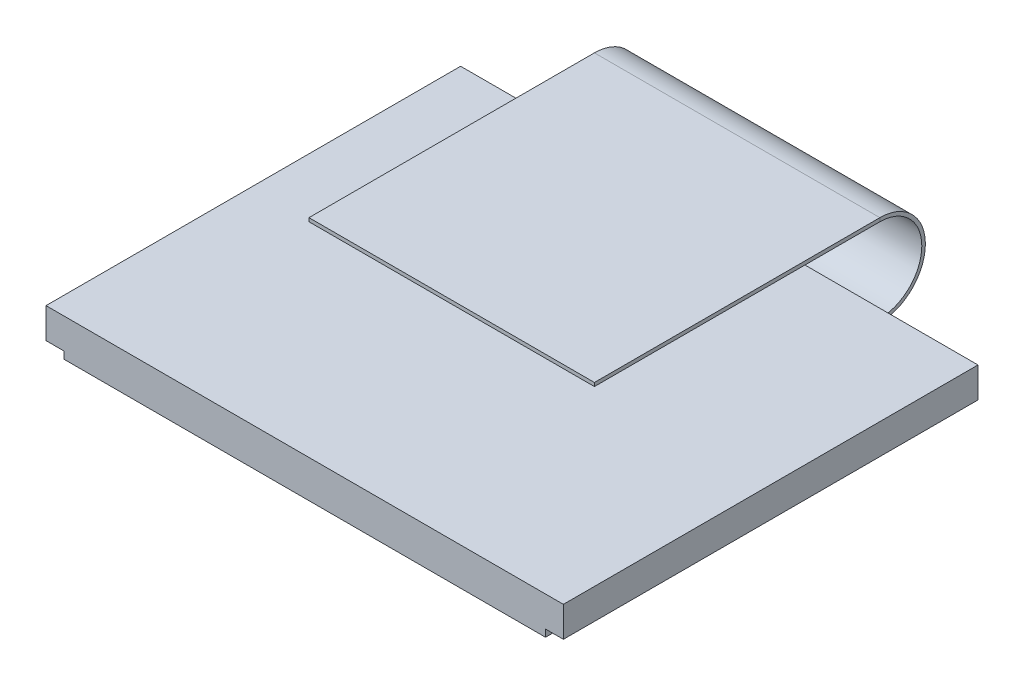
ISO-10303-21;
HEADER;
FILE_DESCRIPTION(('STEP AP214'),'2;1');
FILE_NAME('part.step','',(''),(''),'','','');
FILE_SCHEMA(('AUTOMOTIVE_DESIGN { 1 0 10303 214 1 1 1 1 }'));
ENDSEC;
DATA;
#1=APPLICATION_CONTEXT('core data for automotive mechanical design processes');
#2=APPLICATION_PROTOCOL_DEFINITION('international standard','automotive_design',2000,#1);
#3=PRODUCT_CONTEXT('',#1,'mechanical');
#4=PRODUCT('Part','Part','',(#3));
#5=PRODUCT_RELATED_PRODUCT_CATEGORY('part','',(#4));
#6=PRODUCT_DEFINITION_FORMATION('','',#4);
#7=PRODUCT_DEFINITION_CONTEXT('part definition',#1,'design');
#8=PRODUCT_DEFINITION('design','',#6,#7);
#9=PRODUCT_DEFINITION_SHAPE('','',#8);
#10=(LENGTH_UNIT() NAMED_UNIT(*) SI_UNIT(.MILLI.,.METRE.));
#11=(NAMED_UNIT(*) PLANE_ANGLE_UNIT() SI_UNIT($,.RADIAN.));
#12=(NAMED_UNIT(*) SI_UNIT($,.STERADIAN.) SOLID_ANGLE_UNIT());
#13=UNCERTAINTY_MEASURE_WITH_UNIT(LENGTH_MEASURE(1.E-05),#10,'distance_accuracy_value','');
#14=(GEOMETRIC_REPRESENTATION_CONTEXT(3) GLOBAL_UNCERTAINTY_ASSIGNED_CONTEXT((#13)) GLOBAL_UNIT_ASSIGNED_CONTEXT((#10,
#11,#12)) REPRESENTATION_CONTEXT('',''));
#15=CARTESIAN_POINT('',(0.,0.,0.));
#16=DIRECTION('',(0.,0.,1.));
#17=DIRECTION('',(1.,0.,0.));
#18=AXIS2_PLACEMENT_3D('',#15,#16,#17);
#19=CARTESIAN_POINT('',(-7.24999999999996,0.425,-5.81));
#20=DIRECTION('',(0.,0.,1.));
#21=DIRECTION('',(1.,0.,0.));
#22=AXIS2_PLACEMENT_3D('',#19,#20,#21);
#23=PLANE('',#22);
#24=DIRECTION('',(0.,1.,0.));
#25=VECTOR('',#24,1.);
#26=CARTESIAN_POINT('',(-4.,-0.425,-5.81));
#27=LINE('',#26,#25);
#28=CARTESIAN_POINT('',(-4.,-0.425,-5.81));
#29=VERTEX_POINT('',#28);
#30=CARTESIAN_POINT('',(-4.,-0.325,-5.81));
#31=VERTEX_POINT('',#30);
#32=EDGE_CURVE('E309',#29,#31,#27,.T.);
#33=ORIENTED_EDGE('',*,*,#32,.F.);
#34=DIRECTION('',(-1.,0.,0.));
#35=VECTOR('',#34,1.);
#36=CARTESIAN_POINT('',(-7.24999999999996,-0.425,-5.81));
#37=LINE('',#36,#35);
#38=CARTESIAN_POINT('',(-7.24999999999996,-0.425,-5.81));
#39=VERTEX_POINT('',#38);
#40=EDGE_CURVE('E289',#29,#39,#37,.T.);
#41=ORIENTED_EDGE('',*,*,#40,.T.);
#42=DIRECTION('',(0.,-1.,0.));
#43=VECTOR('',#42,1.);
#44=CARTESIAN_POINT('',(-7.24999999999996,0.425,-5.81));
#45=LINE('',#44,#43);
#46=CARTESIAN_POINT('',(-7.24999999999996,0.425,-5.81));
#47=VERTEX_POINT('',#46);
#48=EDGE_CURVE('E488',#47,#39,#45,.T.);
#49=ORIENTED_EDGE('',*,*,#48,.F.);
#50=DIRECTION('',(-1.,0.,0.));
#51=VECTOR('',#50,1.);
#52=CARTESIAN_POINT('',(-7.24999999999996,0.425,-5.81));
#53=LINE('',#52,#51);
#54=CARTESIAN_POINT('',(7.25000000000003,0.425,-5.81));
#55=VERTEX_POINT('',#54);
#56=EDGE_CURVE('E466',#55,#47,#53,.T.);
#57=ORIENTED_EDGE('',*,*,#56,.F.);
#58=DIRECTION('',(0.,-1.,0.));
#59=VECTOR('',#58,1.);
#60=CARTESIAN_POINT('',(7.25000000000003,0.425,-5.81));
#61=LINE('',#60,#59);
#62=CARTESIAN_POINT('',(7.25000000000003,-0.425,-5.81));
#63=VERTEX_POINT('',#62);
#64=EDGE_CURVE('E491',#55,#63,#61,.T.);
#65=ORIENTED_EDGE('',*,*,#64,.T.);
#66=CARTESIAN_POINT('',(4.,-0.425,-5.81));
#67=VERTEX_POINT('',#66);
#68=EDGE_CURVE('E476',#63,#67,#37,.T.);
#69=ORIENTED_EDGE('',*,*,#68,.T.);
#70=DIRECTION('',(0.,-1.,0.));
#71=VECTOR('',#70,1.);
#72=CARTESIAN_POINT('',(4.,-0.425,-5.81));
#73=LINE('',#72,#71);
#74=CARTESIAN_POINT('',(4.,-0.325,-5.81));
#75=VERTEX_POINT('',#74);
#76=EDGE_CURVE('E56',#75,#67,#73,.T.);
#77=ORIENTED_EDGE('',*,*,#76,.F.);
#78=DIRECTION('',(1.,0.,0.));
#79=VECTOR('',#78,1.);
#80=CARTESIAN_POINT('',(4.,-0.325,-5.81));
#81=LINE('',#80,#79);
#82=EDGE_CURVE('E60',#31,#75,#81,.T.);
#83=ORIENTED_EDGE('',*,*,#82,.F.);
#84=EDGE_LOOP('',(#33,#41,#49,#57,#65,#69,#77,#83));
#85=FACE_BOUND('',#84,.T.);
#86=ADVANCED_FACE('F41',(#85),#23,.F.);
#87=CARTESIAN_POINT('',(0.,-0.425,0.));
#88=DIRECTION('',(0.,1.,0.));
#89=DIRECTION('',(0.,0.,1.));
#90=AXIS2_PLACEMENT_3D('',#87,#88,#89);
#91=PLANE('',#90);
#92=DIRECTION('',(0.,0.,-1.));
#93=VECTOR('',#92,1.);
#94=CARTESIAN_POINT('',(-3.2893,-0.425,-4.992696));
#95=LINE('',#94,#93);
#96=CARTESIAN_POINT('',(-3.2893,-0.425,-4.992696));
#97=VERTEX_POINT('',#96);
#98=CARTESIAN_POINT('',(-3.2893,-0.425,-6.31));
#99=VERTEX_POINT('',#98);
#100=EDGE_CURVE('E380',#97,#99,#95,.T.);
#101=ORIENTED_EDGE('',*,*,#100,.F.);
#102=DIRECTION('',(1.,0.,0.));
#103=VECTOR('',#102,1.);
#104=CARTESIAN_POINT('',(-6.096,-0.425,-4.992696));
#105=LINE('',#104,#103);
#106=CARTESIAN_POINT('',(-5.334,-0.425,-4.992696));
#107=VERTEX_POINT('',#106);
#108=EDGE_CURVE('E377',#107,#97,#105,.T.);
#109=ORIENTED_EDGE('',*,*,#108,.F.);
#110=CARTESIAN_POINT('',(-5.334,-0.425,-4.23069600000001));
#111=DIRECTION('',(0.,1.,0.));
#112=DIRECTION('',(0.,0.,1.));
#113=AXIS2_PLACEMENT_3D('',#110,#111,#112);
#114=CIRCLE('',#113,0.762);
#115=CARTESIAN_POINT('',(-6.096,-0.425,-4.23069600000001));
#116=VERTEX_POINT('',#115);
#117=EDGE_CURVE('E510',#107,#116,#114,.T.);
#118=ORIENTED_EDGE('',*,*,#117,.T.);
#119=DIRECTION('',(0.,0.,-1.));
#120=VECTOR('',#119,1.);
#121=CARTESIAN_POINT('',(-6.096,-0.425,-2.452696));
#122=LINE('',#121,#120);
#123=CARTESIAN_POINT('',(-6.096,-0.425,-2.452696));
#124=VERTEX_POINT('',#123);
#125=EDGE_CURVE('E374',#124,#116,#122,.T.);
#126=ORIENTED_EDGE('',*,*,#125,.F.);
#127=DIRECTION('',(-1.,0.,0.));
#128=VECTOR('',#127,1.);
#129=CARTESIAN_POINT('',(-6.096,-0.425,-2.452696));
#130=LINE('',#129,#128);
#131=CARTESIAN_POINT('',(6.096,-0.425,-2.452696));
#132=VERTEX_POINT('',#131);
#133=EDGE_CURVE('E372',#132,#124,#130,.T.);
#134=ORIENTED_EDGE('',*,*,#133,.F.);
#135=DIRECTION('',(0.,0.,1.));
#136=VECTOR('',#135,1.);
#137=CARTESIAN_POINT('',(6.096,-0.425,-2.452696));
#138=LINE('',#137,#136);
#139=CARTESIAN_POINT('',(6.096,-0.425,-4.23069600000001));
#140=VERTEX_POINT('',#139);
#141=EDGE_CURVE('E370',#140,#132,#138,.T.);
#142=ORIENTED_EDGE('',*,*,#141,.F.);
#143=CARTESIAN_POINT('',(5.334,-0.425,-4.23069600000001));
#144=DIRECTION('',(0.,1.,0.));
#145=DIRECTION('',(0.,0.,1.));
#146=AXIS2_PLACEMENT_3D('',#143,#144,#145);
#147=CIRCLE('',#146,0.762);
#148=CARTESIAN_POINT('',(5.334,-0.425,-4.992696));
#149=VERTEX_POINT('',#148);
#150=EDGE_CURVE('E508',#140,#149,#147,.T.);
#151=ORIENTED_EDGE('',*,*,#150,.T.);
#152=DIRECTION('',(1.,0.,0.));
#153=VECTOR('',#152,1.);
#154=CARTESIAN_POINT('',(3.2893,-0.425,-4.992696));
#155=LINE('',#154,#153);
#156=CARTESIAN_POINT('',(3.2893,-0.425,-4.992696));
#157=VERTEX_POINT('',#156);
#158=EDGE_CURVE('E345',#157,#149,#155,.T.);
#159=ORIENTED_EDGE('',*,*,#158,.F.);
#160=DIRECTION('',(0.,0.,1.));
#161=VECTOR('',#160,1.);
#162=CARTESIAN_POINT('',(3.2893,-0.425,-4.992696));
#163=LINE('',#162,#161);
#164=CARTESIAN_POINT('',(3.2893,-0.425,-6.31));
#165=VERTEX_POINT('',#164);
#166=EDGE_CURVE('E385',#165,#157,#163,.T.);
#167=ORIENTED_EDGE('',*,*,#166,.F.);
#168=DIRECTION('',(-1.,0.,0.));
#169=VECTOR('',#168,1.);
#170=CARTESIAN_POINT('',(4.,-0.425,-6.31));
#171=LINE('',#170,#169);
#172=CARTESIAN_POINT('',(4.,-0.425,-6.31));
#173=VERTEX_POINT('',#172);
#174=EDGE_CURVE('E267',#173,#165,#171,.T.);
#175=ORIENTED_EDGE('',*,*,#174,.F.);
#176=DIRECTION('',(0.,0.,-1.));
#177=VECTOR('',#176,1.);
#178=CARTESIAN_POINT('',(4.,-0.425,-5.81));
#179=LINE('',#178,#177);
#180=EDGE_CURVE('E265',#67,#173,#179,.T.);
#181=ORIENTED_EDGE('',*,*,#180,.F.);
#182=ORIENTED_EDGE('',*,*,#68,.F.);
#183=DIRECTION('',(0.,0.,-1.));
#184=VECTOR('',#183,1.);
#185=CARTESIAN_POINT('',(7.25000000000003,-0.425,-5.81));
#186=LINE('',#185,#184);
#187=CARTESIAN_POINT('',(7.25000000000003,-0.425,5.81));
#188=VERTEX_POINT('',#187);
#189=EDGE_CURVE('E462',#188,#63,#186,.T.);
#190=ORIENTED_EDGE('',*,*,#189,.F.);
#191=DIRECTION('',(1.,0.,0.));
#192=VECTOR('',#191,1.);
#193=CARTESIAN_POINT('',(-7.24999999999996,-0.425,5.81));
#194=LINE('',#193,#192);
#195=CARTESIAN_POINT('',(6.75,-0.425,5.81));
#196=VERTEX_POINT('',#195);
#197=EDGE_CURVE('E480',#196,#188,#194,.T.);
#198=ORIENTED_EDGE('',*,*,#197,.F.);
#199=DIRECTION('',(0.,0.,1.));
#200=VECTOR('',#199,1.);
#201=CARTESIAN_POINT('',(6.75,-0.425,5.81));
#202=LINE('',#201,#200);
#203=CARTESIAN_POINT('',(6.75,-0.425,-2.29));
#204=VERTEX_POINT('',#203);
#205=EDGE_CURVE('E432',#204,#196,#202,.T.);
#206=ORIENTED_EDGE('',*,*,#205,.F.);
#207=DIRECTION('',(1.,0.,0.));
#208=VECTOR('',#207,1.);
#209=CARTESIAN_POINT('',(-6.75,-0.425,-2.29));
#210=LINE('',#209,#208);
#211=CARTESIAN_POINT('',(-6.75,-0.425,-2.29));
#212=VERTEX_POINT('',#211);
#213=EDGE_CURVE('E437',#212,#204,#210,.T.);
#214=ORIENTED_EDGE('',*,*,#213,.F.);
#215=DIRECTION('',(0.,0.,-1.));
#216=VECTOR('',#215,1.);
#217=CARTESIAN_POINT('',(-6.75,-0.425,5.81));
#218=LINE('',#217,#216);
#219=CARTESIAN_POINT('',(-6.75,-0.425,5.81));
#220=VERTEX_POINT('',#219);
#221=EDGE_CURVE('E446',#220,#212,#218,.T.);
#222=ORIENTED_EDGE('',*,*,#221,.F.);
#223=CARTESIAN_POINT('',(-7.24999999999996,-0.425,5.81));
#224=VERTEX_POINT('',#223);
#225=EDGE_CURVE('E467',#224,#220,#194,.T.);
#226=ORIENTED_EDGE('',*,*,#225,.F.);
#227=DIRECTION('',(0.,0.,1.));
#228=VECTOR('',#227,1.);
#229=CARTESIAN_POINT('',(-7.24999999999996,-0.425,-5.81));
#230=LINE('',#229,#228);
#231=EDGE_CURVE('E478',#39,#224,#230,.T.);
#232=ORIENTED_EDGE('',*,*,#231,.F.);
#233=ORIENTED_EDGE('',*,*,#40,.F.);
#234=DIRECTION('',(0.,0.,-1.));
#235=VECTOR('',#234,1.);
#236=CARTESIAN_POINT('',(-4.,-0.425,-5.81));
#237=LINE('',#236,#235);
#238=CARTESIAN_POINT('',(-4.,-0.425,-6.31));
#239=VERTEX_POINT('',#238);
#240=EDGE_CURVE('E282',#29,#239,#237,.T.);
#241=ORIENTED_EDGE('',*,*,#240,.T.);
#242=EDGE_CURVE('E254',#99,#239,#171,.T.);
#243=ORIENTED_EDGE('',*,*,#242,.F.);
#244=EDGE_LOOP('',(#101,#109,#118,#126,#134,#142,#151,#159,#167,#175,#181,#182,#190,#198,#206,
#214,#222,#226,#232,#233,#241,#243));
#245=FACE_BOUND('',#244,.T.);
#246=ADVANCED_FACE('F287',(#245),#91,.F.);
#247=CARTESIAN_POINT('',(7.25000000000003,0.425,-5.81));
#248=DIRECTION('',(-1.,0.,0.));
#249=DIRECTION('',(0.,0.,1.));
#250=AXIS2_PLACEMENT_3D('',#247,#248,#249);
#251=PLANE('',#250);
#252=ORIENTED_EDGE('',*,*,#189,.T.);
#253=ORIENTED_EDGE('',*,*,#64,.F.);
#254=DIRECTION('',(0.,0.,-1.));
#255=VECTOR('',#254,1.);
#256=CARTESIAN_POINT('',(7.25000000000003,0.425,-5.81));
#257=LINE('',#256,#255);
#258=CARTESIAN_POINT('',(7.25000000000003,0.425,5.81));
#259=VERTEX_POINT('',#258);
#260=EDGE_CURVE('E463',#259,#55,#257,.T.);
#261=ORIENTED_EDGE('',*,*,#260,.F.);
#262=DIRECTION('',(0.,-1.,0.));
#263=VECTOR('',#262,1.);
#264=CARTESIAN_POINT('',(7.25000000000003,0.425,5.81));
#265=LINE('',#264,#263);
#266=EDGE_CURVE('E473',#259,#188,#265,.T.);
#267=ORIENTED_EDGE('',*,*,#266,.T.);
#268=EDGE_LOOP('',(#252,#253,#261,#267));
#269=FACE_BOUND('',#268,.T.);
#270=ADVANCED_FACE('F624',(#269),#251,.F.);
#271=CARTESIAN_POINT('',(-7.24999999999996,0.425,-5.81));
#272=DIRECTION('',(1.,0.,0.));
#273=DIRECTION('',(0.,0.,-1.));
#274=AXIS2_PLACEMENT_3D('',#271,#272,#273);
#275=PLANE('',#274);
#276=ORIENTED_EDGE('',*,*,#231,.T.);
#277=DIRECTION('',(0.,-1.,0.));
#278=VECTOR('',#277,1.);
#279=CARTESIAN_POINT('',(-7.24999999999996,0.425,5.81));
#280=LINE('',#279,#278);
#281=CARTESIAN_POINT('',(-7.24999999999996,0.425,5.81));
#282=VERTEX_POINT('',#281);
#283=EDGE_CURVE('E485',#282,#224,#280,.T.);
#284=ORIENTED_EDGE('',*,*,#283,.F.);
#285=DIRECTION('',(0.,0.,1.));
#286=VECTOR('',#285,1.);
#287=CARTESIAN_POINT('',(-7.24999999999996,0.425,-5.81));
#288=LINE('',#287,#286);
#289=EDGE_CURVE('E469',#47,#282,#288,.T.);
#290=ORIENTED_EDGE('',*,*,#289,.F.);
#291=ORIENTED_EDGE('',*,*,#48,.T.);
#292=EDGE_LOOP('',(#276,#284,#290,#291));
#293=FACE_BOUND('',#292,.T.);
#294=ADVANCED_FACE('F628',(#293),#275,.F.);
#295=CARTESIAN_POINT('',(-7.24999999999996,0.425,5.81));
#296=DIRECTION('',(0.,0.,-1.));
#297=DIRECTION('',(-1.,0.,0.));
#298=AXIS2_PLACEMENT_3D('',#295,#296,#297);
#299=PLANE('',#298);
#300=ORIENTED_EDGE('',*,*,#225,.T.);
#301=DIRECTION('',(0.,1.,0.));
#302=VECTOR('',#301,1.);
#303=CARTESIAN_POINT('',(-6.75,-0.625,5.81));
#304=LINE('',#303,#302);
#305=CARTESIAN_POINT('',(-6.75,-0.625,5.81));
#306=VERTEX_POINT('',#305);
#307=EDGE_CURVE('E456',#306,#220,#304,.T.);
#308=ORIENTED_EDGE('',*,*,#307,.F.);
#309=DIRECTION('',(-1.,0.,0.));
#310=VECTOR('',#309,1.);
#311=CARTESIAN_POINT('',(-6.75,-0.625,5.81));
#312=LINE('',#311,#310);
#313=CARTESIAN_POINT('',(6.75,-0.625,5.81));
#314=VERTEX_POINT('',#313);
#315=EDGE_CURVE('E436',#314,#306,#312,.T.);
#316=ORIENTED_EDGE('',*,*,#315,.F.);
#317=DIRECTION('',(0.,1.,0.));
#318=VECTOR('',#317,1.);
#319=CARTESIAN_POINT('',(6.75,-0.625,5.81));
#320=LINE('',#319,#318);
#321=EDGE_CURVE('E459',#314,#196,#320,.T.);
#322=ORIENTED_EDGE('',*,*,#321,.T.);
#323=ORIENTED_EDGE('',*,*,#197,.T.);
#324=ORIENTED_EDGE('',*,*,#266,.F.);
#325=DIRECTION('',(1.,0.,0.));
#326=VECTOR('',#325,1.);
#327=CARTESIAN_POINT('',(-7.24999999999996,0.425,5.81));
#328=LINE('',#327,#326);
#329=EDGE_CURVE('E471',#282,#259,#328,.T.);
#330=ORIENTED_EDGE('',*,*,#329,.F.);
#331=ORIENTED_EDGE('',*,*,#283,.T.);
#332=EDGE_LOOP('',(#300,#308,#316,#322,#323,#324,#330,#331));
#333=FACE_BOUND('',#332,.T.);
#334=ADVANCED_FACE('F915',(#333),#299,.F.);
#335=CARTESIAN_POINT('',(0.,0.425,0.));
#336=DIRECTION('',(0.,1.,0.));
#337=DIRECTION('',(0.,0.,1.));
#338=AXIS2_PLACEMENT_3D('',#335,#336,#337);
#339=PLANE('',#338);
#340=ORIENTED_EDGE('',*,*,#260,.T.);
#341=ORIENTED_EDGE('',*,*,#56,.T.);
#342=ORIENTED_EDGE('',*,*,#289,.T.);
#343=ORIENTED_EDGE('',*,*,#329,.T.);
#344=EDGE_LOOP('',(#340,#341,#342,#343));
#345=FACE_BOUND('',#344,.T.);
#346=ADVANCED_FACE('F924',(#345),#339,.T.);
#347=CARTESIAN_POINT('',(6.75,-0.625,5.81));
#348=DIRECTION('',(-1.,0.,0.));
#349=DIRECTION('',(0.,0.,1.));
#350=AXIS2_PLACEMENT_3D('',#347,#348,#349);
#351=PLANE('',#350);
#352=ORIENTED_EDGE('',*,*,#205,.T.);
#353=ORIENTED_EDGE('',*,*,#321,.F.);
#354=DIRECTION('',(0.,0.,1.));
#355=VECTOR('',#354,1.);
#356=CARTESIAN_POINT('',(6.75,-0.625,5.81));
#357=LINE('',#356,#355);
#358=CARTESIAN_POINT('',(6.75,-0.625,-2.29));
#359=VERTEX_POINT('',#358);
#360=EDGE_CURVE('E433',#359,#314,#357,.T.);
#361=ORIENTED_EDGE('',*,*,#360,.F.);
#362=DIRECTION('',(0.,1.,0.));
#363=VECTOR('',#362,1.);
#364=CARTESIAN_POINT('',(6.75,-0.625,-2.29));
#365=LINE('',#364,#363);
#366=EDGE_CURVE('E443',#359,#204,#365,.T.);
#367=ORIENTED_EDGE('',*,*,#366,.T.);
#368=EDGE_LOOP('',(#352,#353,#361,#367));
#369=FACE_BOUND('',#368,.T.);
#370=ADVANCED_FACE('F933',(#369),#351,.F.);
#371=CARTESIAN_POINT('',(-6.75,-0.625,5.81));
#372=DIRECTION('',(1.,0.,0.));
#373=DIRECTION('',(0.,0.,-1.));
#374=AXIS2_PLACEMENT_3D('',#371,#372,#373);
#375=PLANE('',#374);
#376=ORIENTED_EDGE('',*,*,#221,.T.);
#377=DIRECTION('',(0.,1.,0.));
#378=VECTOR('',#377,1.);
#379=CARTESIAN_POINT('',(-6.75,-0.625,-2.29));
#380=LINE('',#379,#378);
#381=CARTESIAN_POINT('',(-6.75,-0.625,-2.29));
#382=VERTEX_POINT('',#381);
#383=EDGE_CURVE('E453',#382,#212,#380,.T.);
#384=ORIENTED_EDGE('',*,*,#383,.F.);
#385=DIRECTION('',(0.,0.,-1.));
#386=VECTOR('',#385,1.);
#387=CARTESIAN_POINT('',(-6.75,-0.625,5.81));
#388=LINE('',#387,#386);
#389=EDGE_CURVE('E439',#306,#382,#388,.T.);
#390=ORIENTED_EDGE('',*,*,#389,.F.);
#391=ORIENTED_EDGE('',*,*,#307,.T.);
#392=EDGE_LOOP('',(#376,#384,#390,#391));
#393=FACE_BOUND('',#392,.T.);
#394=ADVANCED_FACE('F941',(#393),#375,.F.);
#395=CARTESIAN_POINT('',(-6.75,-0.625,-2.29));
#396=DIRECTION('',(0.,0.,1.));
#397=DIRECTION('',(1.,0.,0.));
#398=AXIS2_PLACEMENT_3D('',#395,#396,#397);
#399=PLANE('',#398);
#400=ORIENTED_EDGE('',*,*,#213,.T.);
#401=ORIENTED_EDGE('',*,*,#366,.F.);
#402=DIRECTION('',(1.,0.,0.));
#403=VECTOR('',#402,1.);
#404=CARTESIAN_POINT('',(-6.75,-0.625,-2.29));
#405=LINE('',#404,#403);
#406=EDGE_CURVE('E441',#382,#359,#405,.T.);
#407=ORIENTED_EDGE('',*,*,#406,.F.);
#408=ORIENTED_EDGE('',*,*,#383,.T.);
#409=EDGE_LOOP('',(#400,#401,#407,#408));
#410=FACE_BOUND('',#409,.T.);
#411=ADVANCED_FACE('F950',(#410),#399,.F.);
#412=CARTESIAN_POINT('',(0.,-0.625,0.));
#413=DIRECTION('',(0.,-1.,0.));
#414=DIRECTION('',(0.,0.,-1.));
#415=AXIS2_PLACEMENT_3D('',#412,#413,#414);
#416=PLANE('',#415);
#417=DIRECTION('',(0.,0.,1.));
#418=VECTOR('',#417,1.);
#419=CARTESIAN_POINT('',(6.29,-0.625,5.));
#420=LINE('',#419,#418);
#421=CARTESIAN_POINT('',(6.29,-0.625,-1.98));
#422=VERTEX_POINT('',#421);
#423=CARTESIAN_POINT('',(6.29,-0.625,5.));
#424=VERTEX_POINT('',#423);
#425=EDGE_CURVE('E399',#422,#424,#420,.T.);
#426=ORIENTED_EDGE('',*,*,#425,.F.);
#427=DIRECTION('',(1.,0.,0.));
#428=VECTOR('',#427,1.);
#429=CARTESIAN_POINT('',(-6.29,-0.625,-1.98));
#430=LINE('',#429,#428);
#431=CARTESIAN_POINT('',(-6.29,-0.625,-1.98));
#432=VERTEX_POINT('',#431);
#433=EDGE_CURVE('E404',#432,#422,#430,.T.);
#434=ORIENTED_EDGE('',*,*,#433,.F.);
#435=DIRECTION('',(0.,0.,-1.));
#436=VECTOR('',#435,1.);
#437=CARTESIAN_POINT('',(-6.29,-0.625,5.));
#438=LINE('',#437,#436);
#439=CARTESIAN_POINT('',(-6.29,-0.625,5.));
#440=VERTEX_POINT('',#439);
#441=EDGE_CURVE('E416',#440,#432,#438,.T.);
#442=ORIENTED_EDGE('',*,*,#441,.F.);
#443=DIRECTION('',(-1.,0.,0.));
#444=VECTOR('',#443,1.);
#445=CARTESIAN_POINT('',(-6.29,-0.625,5.));
#446=LINE('',#445,#444);
#447=EDGE_CURVE('E413',#424,#440,#446,.T.);
#448=ORIENTED_EDGE('',*,*,#447,.F.);
#449=EDGE_LOOP('',(#426,#434,#442,#448));
#450=FACE_BOUND('',#449,.T.);
#451=ORIENTED_EDGE('',*,*,#360,.T.);
#452=ORIENTED_EDGE('',*,*,#315,.T.);
#453=ORIENTED_EDGE('',*,*,#389,.T.);
#454=ORIENTED_EDGE('',*,*,#406,.T.);
#455=EDGE_LOOP('',(#451,#452,#453,#454));
#456=FACE_BOUND('',#455,.T.);
#457=ADVANCED_FACE('F959',(#450,#456),#416,.T.);
#458=CARTESIAN_POINT('',(6.29,-0.775,5.));
#459=DIRECTION('',(-1.,0.,0.));
#460=DIRECTION('',(0.,0.,1.));
#461=AXIS2_PLACEMENT_3D('',#458,#459,#460);
#462=PLANE('',#461);
#463=ORIENTED_EDGE('',*,*,#425,.T.);
#464=DIRECTION('',(0.,1.,0.));
#465=VECTOR('',#464,1.);
#466=CARTESIAN_POINT('',(6.29,-0.775,5.));
#467=LINE('',#466,#465);
#468=CARTESIAN_POINT('',(6.29,-0.775,5.));
#469=VERTEX_POINT('',#468);
#470=EDGE_CURVE('E429',#469,#424,#467,.T.);
#471=ORIENTED_EDGE('',*,*,#470,.F.);
#472=DIRECTION('',(0.,0.,1.));
#473=VECTOR('',#472,1.);
#474=CARTESIAN_POINT('',(6.29,-0.775,5.));
#475=LINE('',#474,#473);
#476=CARTESIAN_POINT('',(6.29,-0.775,-1.98));
#477=VERTEX_POINT('',#476);
#478=EDGE_CURVE('E400',#477,#469,#475,.T.);
#479=ORIENTED_EDGE('',*,*,#478,.F.);
#480=DIRECTION('',(0.,1.,0.));
#481=VECTOR('',#480,1.);
#482=CARTESIAN_POINT('',(6.29,-0.775,-1.98));
#483=LINE('',#482,#481);
#484=EDGE_CURVE('E410',#477,#422,#483,.T.);
#485=ORIENTED_EDGE('',*,*,#484,.T.);
#486=EDGE_LOOP('',(#463,#471,#479,#485));
#487=FACE_BOUND('',#486,.T.);
#488=ADVANCED_FACE('F966',(#487),#462,.F.);
#489=CARTESIAN_POINT('',(-6.29,-0.775,5.));
#490=DIRECTION('',(0.,0.,-1.));
#491=DIRECTION('',(-1.,0.,0.));
#492=AXIS2_PLACEMENT_3D('',#489,#490,#491);
#493=PLANE('',#492);
#494=ORIENTED_EDGE('',*,*,#447,.T.);
#495=DIRECTION('',(0.,1.,0.));
#496=VECTOR('',#495,1.);
#497=CARTESIAN_POINT('',(-6.29,-0.775,5.));
#498=LINE('',#497,#496);
#499=CARTESIAN_POINT('',(-6.29,-0.775,5.));
#500=VERTEX_POINT('',#499);
#501=EDGE_CURVE('E426',#500,#440,#498,.T.);
#502=ORIENTED_EDGE('',*,*,#501,.F.);
#503=DIRECTION('',(-1.,0.,0.));
#504=VECTOR('',#503,1.);
#505=CARTESIAN_POINT('',(-6.29,-0.775,5.));
#506=LINE('',#505,#504);
#507=EDGE_CURVE('E403',#469,#500,#506,.T.);
#508=ORIENTED_EDGE('',*,*,#507,.F.);
#509=ORIENTED_EDGE('',*,*,#470,.T.);
#510=EDGE_LOOP('',(#494,#502,#508,#509));
#511=FACE_BOUND('',#510,.T.);
#512=ADVANCED_FACE('F976',(#511),#493,.F.);
#513=CARTESIAN_POINT('',(-6.29,-0.775,5.));
#514=DIRECTION('',(1.,0.,0.));
#515=DIRECTION('',(0.,0.,-1.));
#516=AXIS2_PLACEMENT_3D('',#513,#514,#515);
#517=PLANE('',#516);
#518=ORIENTED_EDGE('',*,*,#441,.T.);
#519=DIRECTION('',(0.,1.,0.));
#520=VECTOR('',#519,1.);
#521=CARTESIAN_POINT('',(-6.29,-0.775,-1.98));
#522=LINE('',#521,#520);
#523=CARTESIAN_POINT('',(-6.29,-0.775,-1.98));
#524=VERTEX_POINT('',#523);
#525=EDGE_CURVE('E423',#524,#432,#522,.T.);
#526=ORIENTED_EDGE('',*,*,#525,.F.);
#527=DIRECTION('',(0.,0.,-1.));
#528=VECTOR('',#527,1.);
#529=CARTESIAN_POINT('',(-6.29,-0.775,5.));
#530=LINE('',#529,#528);
#531=EDGE_CURVE('E406',#500,#524,#530,.T.);
#532=ORIENTED_EDGE('',*,*,#531,.F.);
#533=ORIENTED_EDGE('',*,*,#501,.T.);
#534=EDGE_LOOP('',(#518,#526,#532,#533));
#535=FACE_BOUND('',#534,.T.);
#536=ADVANCED_FACE('F985',(#535),#517,.F.);
#537=CARTESIAN_POINT('',(-6.29,-0.775,-1.98));
#538=DIRECTION('',(0.,0.,1.));
#539=DIRECTION('',(1.,0.,0.));
#540=AXIS2_PLACEMENT_3D('',#537,#538,#539);
#541=PLANE('',#540);
#542=ORIENTED_EDGE('',*,*,#433,.T.);
#543=ORIENTED_EDGE('',*,*,#484,.F.);
#544=DIRECTION('',(1.,0.,0.));
#545=VECTOR('',#544,1.);
#546=CARTESIAN_POINT('',(-6.29,-0.775,-1.98));
#547=LINE('',#546,#545);
#548=EDGE_CURVE('E408',#524,#477,#547,.T.);
#549=ORIENTED_EDGE('',*,*,#548,.F.);
#550=ORIENTED_EDGE('',*,*,#525,.T.);
#551=EDGE_LOOP('',(#542,#543,#549,#550));
#552=FACE_BOUND('',#551,.T.);
#553=ADVANCED_FACE('F993',(#552),#541,.F.);
#554=CARTESIAN_POINT('',(0.,-0.775,0.));
#555=DIRECTION('',(0.,-1.,0.));
#556=DIRECTION('',(0.,0.,-1.));
#557=AXIS2_PLACEMENT_3D('',#554,#555,#556);
#558=PLANE('',#557);
#559=ORIENTED_EDGE('',*,*,#478,.T.);
#560=ORIENTED_EDGE('',*,*,#507,.T.);
#561=ORIENTED_EDGE('',*,*,#531,.T.);
#562=ORIENTED_EDGE('',*,*,#548,.T.);
#563=EDGE_LOOP('',(#559,#560,#561,#562));
#564=FACE_BOUND('',#563,.T.);
#565=ADVANCED_FACE('F871',(#564),#558,.T.);
#566=CARTESIAN_POINT('',(0.,-0.425,0.));
#567=DIRECTION('',(0.,1.,0.));
#568=DIRECTION('',(0.,0.,1.));
#569=AXIS2_PLACEMENT_3D('',#566,#567,#568);
#570=PLANE('',#569);
#571=EDGE_CURVE('E261',#165,#99,#171,.T.);
#572=ORIENTED_EDGE('',*,*,#571,.F.);
#573=CARTESIAN_POINT('',(3.2893,-0.425,-7.656286));
#574=VERTEX_POINT('',#573);
#575=EDGE_CURVE('E350',#574,#165,#163,.T.);
#576=ORIENTED_EDGE('',*,*,#575,.F.);
#577=CARTESIAN_POINT('',(3.0893,-0.425,-7.656286));
#578=DIRECTION('',(0.,1.,0.));
#579=DIRECTION('',(0.,0.,1.));
#580=AXIS2_PLACEMENT_3D('',#577,#578,#579);
#581=CIRCLE('',#580,0.2);
#582=CARTESIAN_POINT('',(3.0893,-0.425,-7.856286));
#583=VERTEX_POINT('',#582);
#584=EDGE_CURVE('E518',#574,#583,#581,.T.);
#585=ORIENTED_EDGE('',*,*,#584,.T.);
#586=DIRECTION('',(1.,0.,0.));
#587=VECTOR('',#586,1.);
#588=CARTESIAN_POINT('',(-3.2893,-0.425,-7.856286));
#589=LINE('',#588,#587);
#590=CARTESIAN_POINT('',(-3.0893,-0.425,-7.856286));
#591=VERTEX_POINT('',#590);
#592=EDGE_CURVE('E382',#591,#583,#589,.T.);
#593=ORIENTED_EDGE('',*,*,#592,.F.);
#594=CARTESIAN_POINT('',(-3.0893,-0.425,-7.656286));
#595=DIRECTION('',(0.,1.,0.));
#596=DIRECTION('',(0.,0.,1.));
#597=AXIS2_PLACEMENT_3D('',#594,#595,#596);
#598=CIRCLE('',#597,0.2);
#599=CARTESIAN_POINT('',(-3.2893,-0.425,-7.656286));
#600=VERTEX_POINT('',#599);
#601=EDGE_CURVE('E515',#591,#600,#598,.T.);
#602=ORIENTED_EDGE('',*,*,#601,.T.);
#603=EDGE_CURVE('E379',#99,#600,#95,.T.);
#604=ORIENTED_EDGE('',*,*,#603,.F.);
#605=EDGE_LOOP('',(#572,#576,#585,#593,#602,#604));
#606=FACE_BOUND('',#605,.T.);
#607=ADVANCED_FACE('F542',(#606),#570,.T.);
#608=CARTESIAN_POINT('',(3.2893,-0.60047,-4.992696));
#609=DIRECTION('',(0.,0.,1.));
#610=DIRECTION('',(1.,0.,0.));
#611=AXIS2_PLACEMENT_3D('',#608,#609,#610);
#612=PLANE('',#611);
#613=ORIENTED_EDGE('',*,*,#158,.T.);
#614=DIRECTION('',(0.,1.,0.));
#615=VECTOR('',#614,1.);
#616=CARTESIAN_POINT('',(5.334,-0.60047,-4.992696));
#617=LINE('',#616,#615);
#618=CARTESIAN_POINT('',(5.334,-0.60047,-4.992696));
#619=VERTEX_POINT('',#618);
#620=EDGE_CURVE('E497',#149,#619,#617,.F.);
#621=ORIENTED_EDGE('',*,*,#620,.T.);
#622=DIRECTION('',(1.,0.,0.));
#623=VECTOR('',#622,1.);
#624=CARTESIAN_POINT('',(3.2893,-0.60047,-4.992696));
#625=LINE('',#624,#623);
#626=CARTESIAN_POINT('',(3.2893,-0.60047,-4.992696));
#627=VERTEX_POINT('',#626);
#628=EDGE_CURVE('E346',#627,#619,#625,.T.);
#629=ORIENTED_EDGE('',*,*,#628,.F.);
#630=DIRECTION('',(0.,1.,0.));
#631=VECTOR('',#630,1.);
#632=CARTESIAN_POINT('',(3.2893,-0.60047,-4.992696));
#633=LINE('',#632,#631);
#634=EDGE_CURVE('E367',#627,#157,#633,.T.);
#635=ORIENTED_EDGE('',*,*,#634,.T.);
#636=EDGE_LOOP('',(#613,#621,#629,#635));
#637=FACE_BOUND('',#636,.T.);
#638=ADVANCED_FACE('F584',(#637),#612,.F.);
#639=CARTESIAN_POINT('',(6.096,-0.60047,-2.452696));
#640=DIRECTION('',(-1.,0.,0.));
#641=DIRECTION('',(0.,0.,1.));
#642=AXIS2_PLACEMENT_3D('',#639,#640,#641);
#643=PLANE('',#642);
#644=DIRECTION('',(0.,0.,1.));
#645=VECTOR('',#644,1.);
#646=CARTESIAN_POINT('',(6.096,-0.60047,-2.452696));
#647=LINE('',#646,#645);
#648=CARTESIAN_POINT('',(6.096,-0.60047,-4.23069600000001));
#649=VERTEX_POINT('',#648);
#650=CARTESIAN_POINT('',(6.096,-0.60047,-2.452696));
#651=VERTEX_POINT('',#650);
#652=EDGE_CURVE('E349',#649,#651,#647,.T.);
#653=ORIENTED_EDGE('',*,*,#652,.F.);
#654=DIRECTION('',(0.,1.,0.));
#655=VECTOR('',#654,1.);
#656=CARTESIAN_POINT('',(6.096,-0.60047,-4.23069600000001));
#657=LINE('',#656,#655);
#658=EDGE_CURVE('E494',#649,#140,#657,.T.);
#659=ORIENTED_EDGE('',*,*,#658,.T.);
#660=ORIENTED_EDGE('',*,*,#141,.T.);
#661=DIRECTION('',(0.,1.,0.));
#662=VECTOR('',#661,1.);
#663=CARTESIAN_POINT('',(6.096,-0.60047,-2.452696));
#664=LINE('',#663,#662);
#665=EDGE_CURVE('E396',#651,#132,#664,.T.);
#666=ORIENTED_EDGE('',*,*,#665,.F.);
#667=EDGE_LOOP('',(#653,#659,#660,#666));
#668=FACE_BOUND('',#667,.T.);
#669=ADVANCED_FACE('F577',(#668),#643,.F.);
#670=CARTESIAN_POINT('',(-6.096,-0.60047,-2.452696));
#671=DIRECTION('',(0.,0.,-1.));
#672=DIRECTION('',(-1.,0.,0.));
#673=AXIS2_PLACEMENT_3D('',#670,#671,#672);
#674=PLANE('',#673);
#675=ORIENTED_EDGE('',*,*,#133,.T.);
#676=DIRECTION('',(0.,1.,0.));
#677=VECTOR('',#676,1.);
#678=CARTESIAN_POINT('',(-6.096,-0.60047,-2.452696));
#679=LINE('',#678,#677);
#680=CARTESIAN_POINT('',(-6.096,-0.60047,-2.452696));
#681=VERTEX_POINT('',#680);
#682=EDGE_CURVE('E393',#681,#124,#679,.T.);
#683=ORIENTED_EDGE('',*,*,#682,.F.);
#684=DIRECTION('',(-1.,0.,0.));
#685=VECTOR('',#684,1.);
#686=CARTESIAN_POINT('',(-6.096,-0.60047,-2.452696));
#687=LINE('',#686,#685);
#688=EDGE_CURVE('E352',#651,#681,#687,.T.);
#689=ORIENTED_EDGE('',*,*,#688,.F.);
#690=ORIENTED_EDGE('',*,*,#665,.T.);
#691=EDGE_LOOP('',(#675,#683,#689,#690));
#692=FACE_BOUND('',#691,.T.);
#693=ADVANCED_FACE('F572',(#692),#674,.F.);
#694=CARTESIAN_POINT('',(-6.096,-0.60047,-2.452696));
#695=DIRECTION('',(1.,0.,0.));
#696=DIRECTION('',(0.,0.,-1.));
#697=AXIS2_PLACEMENT_3D('',#694,#695,#696);
#698=PLANE('',#697);
#699=ORIENTED_EDGE('',*,*,#125,.T.);
#700=DIRECTION('',(0.,1.,0.));
#701=VECTOR('',#700,1.);
#702=CARTESIAN_POINT('',(-6.096,-0.60047,-4.23069600000001));
#703=LINE('',#702,#701);
#704=CARTESIAN_POINT('',(-6.096,-0.60047,-4.23069600000001));
#705=VERTEX_POINT('',#704);
#706=EDGE_CURVE('E506',#116,#705,#703,.F.);
#707=ORIENTED_EDGE('',*,*,#706,.T.);
#708=DIRECTION('',(0.,0.,-1.));
#709=VECTOR('',#708,1.);
#710=CARTESIAN_POINT('',(-6.096,-0.60047,-2.452696));
#711=LINE('',#710,#709);
#712=EDGE_CURVE('E354',#681,#705,#711,.T.);
#713=ORIENTED_EDGE('',*,*,#712,.F.);
#714=ORIENTED_EDGE('',*,*,#682,.T.);
#715=EDGE_LOOP('',(#699,#707,#713,#714));
#716=FACE_BOUND('',#715,.T.);
#717=ADVANCED_FACE('F566',(#716),#698,.F.);
#718=CARTESIAN_POINT('',(-6.096,-0.60047,-4.992696));
#719=DIRECTION('',(0.,0.,1.));
#720=DIRECTION('',(1.,0.,0.));
#721=AXIS2_PLACEMENT_3D('',#718,#719,#720);
#722=PLANE('',#721);
#723=DIRECTION('',(1.,0.,0.));
#724=VECTOR('',#723,1.);
#725=CARTESIAN_POINT('',(-6.096,-0.60047,-4.992696));
#726=LINE('',#725,#724);
#727=CARTESIAN_POINT('',(-5.334,-0.60047,-4.992696));
#728=VERTEX_POINT('',#727);
#729=CARTESIAN_POINT('',(-3.2893,-0.60047,-4.992696));
#730=VERTEX_POINT('',#729);
#731=EDGE_CURVE('E357',#728,#730,#726,.T.);
#732=ORIENTED_EDGE('',*,*,#731,.F.);
#733=DIRECTION('',(0.,1.,0.));
#734=VECTOR('',#733,1.);
#735=CARTESIAN_POINT('',(-5.334,-0.60047,-4.992696));
#736=LINE('',#735,#734);
#737=EDGE_CURVE('E503',#728,#107,#736,.T.);
#738=ORIENTED_EDGE('',*,*,#737,.T.);
#739=ORIENTED_EDGE('',*,*,#108,.T.);
#740=DIRECTION('',(0.,1.,0.));
#741=VECTOR('',#740,1.);
#742=CARTESIAN_POINT('',(-3.2893,-0.60047,-4.992696));
#743=LINE('',#742,#741);
#744=EDGE_CURVE('E390',#730,#97,#743,.T.);
#745=ORIENTED_EDGE('',*,*,#744,.F.);
#746=EDGE_LOOP('',(#732,#738,#739,#745));
#747=FACE_BOUND('',#746,.T.);
#748=ADVANCED_FACE('F558',(#747),#722,.F.);
#749=CARTESIAN_POINT('',(-3.2893,-0.60047,-4.992696));
#750=DIRECTION('',(1.,0.,0.));
#751=DIRECTION('',(0.,0.,-1.));
#752=AXIS2_PLACEMENT_3D('',#749,#750,#751);
#753=PLANE('',#752);
#754=ORIENTED_EDGE('',*,*,#100,.T.);
#755=ORIENTED_EDGE('',*,*,#603,.T.);
#756=DIRECTION('',(0.,1.,0.));
#757=VECTOR('',#756,1.);
#758=CARTESIAN_POINT('',(-3.2893,-0.60047,-7.656286));
#759=LINE('',#758,#757);
#760=CARTESIAN_POINT('',(-3.2893,-0.60047,-7.656286));
#761=VERTEX_POINT('',#760);
#762=EDGE_CURVE('E11',#600,#761,#759,.F.);
#763=ORIENTED_EDGE('',*,*,#762,.T.);
#764=DIRECTION('',(0.,0.,-1.));
#765=VECTOR('',#764,1.);
#766=CARTESIAN_POINT('',(-3.2893,-0.60047,-4.992696));
#767=LINE('',#766,#765);
#768=EDGE_CURVE('E359',#730,#761,#767,.T.);
#769=ORIENTED_EDGE('',*,*,#768,.F.);
#770=ORIENTED_EDGE('',*,*,#744,.T.);
#771=EDGE_LOOP('',(#754,#755,#763,#769,#770));
#772=FACE_BOUND('',#771,.T.);
#773=ADVANCED_FACE('F551',(#772),#753,.F.);
#774=CARTESIAN_POINT('',(-3.2893,-0.60047,-7.856286));
#775=DIRECTION('',(0.,0.,1.));
#776=DIRECTION('',(1.,0.,0.));
#777=AXIS2_PLACEMENT_3D('',#774,#775,#776);
#778=PLANE('',#777);
#779=ORIENTED_EDGE('',*,*,#592,.T.);
#780=DIRECTION('',(0.,1.,0.));
#781=VECTOR('',#780,1.);
#782=CARTESIAN_POINT('',(3.0893,-0.60047,-7.856286));
#783=LINE('',#782,#781);
#784=CARTESIAN_POINT('',(3.0893,-0.60047,-7.856286));
#785=VERTEX_POINT('',#784);
#786=EDGE_CURVE('E523',#583,#785,#783,.F.);
#787=ORIENTED_EDGE('',*,*,#786,.T.);
#788=DIRECTION('',(1.,0.,0.));
#789=VECTOR('',#788,1.);
#790=CARTESIAN_POINT('',(-3.2893,-0.60047,-7.856286));
#791=LINE('',#790,#789);
#792=CARTESIAN_POINT('',(-3.0893,-0.60047,-7.856286));
#793=VERTEX_POINT('',#792);
#794=EDGE_CURVE('E362',#793,#785,#791,.T.);
#795=ORIENTED_EDGE('',*,*,#794,.F.);
#796=DIRECTION('',(0.,1.,0.));
#797=VECTOR('',#796,1.);
#798=CARTESIAN_POINT('',(-3.0893,-0.60047,-7.856286));
#799=LINE('',#798,#797);
#800=EDGE_CURVE('E520',#793,#591,#799,.T.);
#801=ORIENTED_EDGE('',*,*,#800,.T.);
#802=EDGE_LOOP('',(#779,#787,#795,#801));
#803=FACE_BOUND('',#802,.T.);
#804=ADVANCED_FACE('F544',(#803),#778,.F.);
#805=CARTESIAN_POINT('',(3.2893,-0.60047,-4.992696));
#806=DIRECTION('',(-1.,0.,0.));
#807=DIRECTION('',(0.,0.,1.));
#808=AXIS2_PLACEMENT_3D('',#805,#806,#807);
#809=PLANE('',#808);
#810=DIRECTION('',(0.,0.,1.));
#811=VECTOR('',#810,1.);
#812=CARTESIAN_POINT('',(3.2893,-0.60047,-4.992696));
#813=LINE('',#812,#811);
#814=CARTESIAN_POINT('',(3.2893,-0.60047,-7.656286));
#815=VERTEX_POINT('',#814);
#816=EDGE_CURVE('E365',#815,#627,#813,.T.);
#817=ORIENTED_EDGE('',*,*,#816,.F.);
#818=DIRECTION('',(0.,1.,0.));
#819=VECTOR('',#818,1.);
#820=CARTESIAN_POINT('',(3.2893,-0.60047,-7.656286));
#821=LINE('',#820,#819);
#822=EDGE_CURVE('E512',#815,#574,#821,.T.);
#823=ORIENTED_EDGE('',*,*,#822,.T.);
#824=ORIENTED_EDGE('',*,*,#575,.T.);
#825=ORIENTED_EDGE('',*,*,#166,.T.);
#826=ORIENTED_EDGE('',*,*,#634,.F.);
#827=EDGE_LOOP('',(#817,#823,#824,#825,#826));
#828=FACE_BOUND('',#827,.T.);
#829=ADVANCED_FACE('F536',(#828),#809,.F.);
#830=CARTESIAN_POINT('',(0.,-0.60047,0.));
#831=DIRECTION('',(0.,1.,0.));
#832=DIRECTION('',(0.,0.,1.));
#833=AXIS2_PLACEMENT_3D('',#830,#831,#832);
#834=PLANE('',#833);
#835=ORIENTED_EDGE('',*,*,#794,.T.);
#836=CARTESIAN_POINT('',(3.0893,-0.60047,-7.656286));
#837=DIRECTION('',(0.,1.,0.));
#838=DIRECTION('',(0.,0.,1.));
#839=AXIS2_PLACEMENT_3D('',#836,#837,#838);
#840=CIRCLE('',#839,0.2);
#841=EDGE_CURVE('E49',#785,#815,#840,.F.);
#842=ORIENTED_EDGE('',*,*,#841,.T.);
#843=ORIENTED_EDGE('',*,*,#816,.T.);
#844=ORIENTED_EDGE('',*,*,#628,.T.);
#845=CARTESIAN_POINT('',(5.334,-0.60047,-4.23069600000001));
#846=DIRECTION('',(0.,1.,0.));
#847=DIRECTION('',(0.,0.,1.));
#848=AXIS2_PLACEMENT_3D('',#845,#846,#847);
#849=CIRCLE('',#848,0.762);
#850=EDGE_CURVE('E501',#619,#649,#849,.F.);
#851=ORIENTED_EDGE('',*,*,#850,.T.);
#852=ORIENTED_EDGE('',*,*,#652,.T.);
#853=ORIENTED_EDGE('',*,*,#688,.T.);
#854=ORIENTED_EDGE('',*,*,#712,.T.);
#855=CARTESIAN_POINT('',(-5.334,-0.60047,-4.23069600000001));
#856=DIRECTION('',(0.,1.,0.));
#857=DIRECTION('',(0.,0.,1.));
#858=AXIS2_PLACEMENT_3D('',#855,#856,#857);
#859=CIRCLE('',#858,0.762);
#860=EDGE_CURVE('E499',#705,#728,#859,.F.);
#861=ORIENTED_EDGE('',*,*,#860,.T.);
#862=ORIENTED_EDGE('',*,*,#731,.T.);
#863=ORIENTED_EDGE('',*,*,#768,.T.);
#864=CARTESIAN_POINT('',(-3.0893,-0.60047,-7.656286));
#865=DIRECTION('',(0.,1.,0.));
#866=DIRECTION('',(0.,0.,1.));
#867=AXIS2_PLACEMENT_3D('',#864,#865,#866);
#868=CIRCLE('',#867,0.2);
#869=EDGE_CURVE('E525',#761,#793,#868,.F.);
#870=ORIENTED_EDGE('',*,*,#869,.T.);
#871=EDGE_LOOP('',(#835,#842,#843,#844,#851,#852,#853,#854,#861,#862,#863,#870));
#872=FACE_BOUND('',#871,.T.);
#873=ADVANCED_FACE('F529',(#872),#834,.F.);
#874=CARTESIAN_POINT('',(5.334,-0.60047,-4.23069600000001));
#875=DIRECTION('',(0.,1.,0.));
#876=DIRECTION('',(0.,0.,1.));
#877=AXIS2_PLACEMENT_3D('',#874,#875,#876);
#878=CYLINDRICAL_SURFACE('',#877,0.762);
#879=ORIENTED_EDGE('',*,*,#850,.F.);
#880=ORIENTED_EDGE('',*,*,#620,.F.);
#881=ORIENTED_EDGE('',*,*,#150,.F.);
#882=ORIENTED_EDGE('',*,*,#658,.F.);
#883=EDGE_LOOP('',(#879,#880,#881,#882));
#884=FACE_BOUND('',#883,.T.);
#885=ADVANCED_FACE('F581',(#884),#878,.T.);
#886=CARTESIAN_POINT('',(-5.334,-0.60047,-4.23069600000001));
#887=DIRECTION('',(0.,1.,0.));
#888=DIRECTION('',(0.,0.,1.));
#889=AXIS2_PLACEMENT_3D('',#886,#887,#888);
#890=CYLINDRICAL_SURFACE('',#889,0.762);
#891=ORIENTED_EDGE('',*,*,#860,.F.);
#892=ORIENTED_EDGE('',*,*,#706,.F.);
#893=ORIENTED_EDGE('',*,*,#117,.F.);
#894=ORIENTED_EDGE('',*,*,#737,.F.);
#895=EDGE_LOOP('',(#891,#892,#893,#894));
#896=FACE_BOUND('',#895,.T.);
#897=ADVANCED_FACE('F562',(#896),#890,.T.);
#898=CARTESIAN_POINT('',(3.0893,-0.60047,-7.656286));
#899=DIRECTION('',(0.,1.,0.));
#900=DIRECTION('',(0.,0.,1.));
#901=AXIS2_PLACEMENT_3D('',#898,#899,#900);
#902=CYLINDRICAL_SURFACE('',#901,0.2);
#903=ORIENTED_EDGE('',*,*,#841,.F.);
#904=ORIENTED_EDGE('',*,*,#786,.F.);
#905=ORIENTED_EDGE('',*,*,#584,.F.);
#906=ORIENTED_EDGE('',*,*,#822,.F.);
#907=EDGE_LOOP('',(#903,#904,#905,#906));
#908=FACE_BOUND('',#907,.T.);
#909=ADVANCED_FACE('F539',(#908),#902,.T.);
#910=CARTESIAN_POINT('',(-3.0893,-0.60047,-7.656286));
#911=DIRECTION('',(0.,1.,0.));
#912=DIRECTION('',(0.,0.,1.));
#913=AXIS2_PLACEMENT_3D('',#910,#911,#912);
#914=CYLINDRICAL_SURFACE('',#913,0.2);
#915=ORIENTED_EDGE('',*,*,#869,.F.);
#916=ORIENTED_EDGE('',*,*,#762,.F.);
#917=ORIENTED_EDGE('',*,*,#601,.F.);
#918=ORIENTED_EDGE('',*,*,#800,.F.);
#919=EDGE_LOOP('',(#915,#916,#917,#918));
#920=FACE_BOUND('',#919,.T.);
#921=ADVANCED_FACE('F43',(#920),#914,.T.);
#922=CARTESIAN_POINT('',(0.,1.7,1.69));
#923=DIRECTION('',(0.,0.,-1.));
#924=DIRECTION('',(1.,0.,0.));
#925=AXIS2_PLACEMENT_3D('',#922,#923,#924);
#926=PLANE('',#925);
#927=DIRECTION('',(0.,-1.,0.));
#928=VECTOR('',#927,1.);
#929=CARTESIAN_POINT('',(-4.,2.125,1.69));
#930=LINE('',#929,#928);
#931=CARTESIAN_POINT('',(-4.,2.125,1.69));
#932=VERTEX_POINT('',#931);
#933=CARTESIAN_POINT('',(-4.,2.025,1.69));
#934=VERTEX_POINT('',#933);
#935=EDGE_CURVE('E298',#932,#934,#930,.T.);
#936=ORIENTED_EDGE('',*,*,#935,.T.);
#937=DIRECTION('',(1.,0.,0.));
#938=VECTOR('',#937,1.);
#939=CARTESIAN_POINT('',(4.,2.025,1.69));
#940=LINE('',#939,#938);
#941=CARTESIAN_POINT('',(4.,2.025,1.69));
#942=VERTEX_POINT('',#941);
#943=EDGE_CURVE('E304',#934,#942,#940,.T.);
#944=ORIENTED_EDGE('',*,*,#943,.T.);
#945=DIRECTION('',(0.,1.,0.));
#946=VECTOR('',#945,1.);
#947=CARTESIAN_POINT('',(4.,2.125,1.69));
#948=LINE('',#947,#946);
#949=CARTESIAN_POINT('',(4.,2.125,1.69));
#950=VERTEX_POINT('',#949);
#951=EDGE_CURVE('E326',#942,#950,#948,.T.);
#952=ORIENTED_EDGE('',*,*,#951,.T.);
#953=DIRECTION('',(-1.,0.,0.));
#954=VECTOR('',#953,1.);
#955=CARTESIAN_POINT('',(4.,2.125,1.69));
#956=LINE('',#955,#954);
#957=EDGE_CURVE('E340',#950,#932,#956,.T.);
#958=ORIENTED_EDGE('',*,*,#957,.T.);
#959=EDGE_LOOP('',(#936,#944,#952,#958));
#960=FACE_BOUND('',#959,.T.);
#961=ADVANCED_FACE('F608',(#960),#926,.F.);
#962=CARTESIAN_POINT('',(-4.,-0.425,-5.81));
#963=DIRECTION('',(-1.,0.,0.));
#964=DIRECTION('',(0.,0.,1.));
#965=AXIS2_PLACEMENT_3D('',#962,#963,#964);
#966=PLANE('',#965);
#967=DIRECTION('',(0.,0.,-1.));
#968=VECTOR('',#967,1.);
#969=CARTESIAN_POINT('',(-4.,-0.325,-5.81));
#970=LINE('',#969,#968);
#971=CARTESIAN_POINT('',(-4.,-0.325,-6.31));
#972=VERTEX_POINT('',#971);
#973=EDGE_CURVE('E284',#31,#972,#970,.T.);
#974=ORIENTED_EDGE('',*,*,#973,.T.);
#975=DIRECTION('',(0.,1.,0.));
#976=VECTOR('',#975,1.);
#977=CARTESIAN_POINT('',(-4.,-0.425,-6.31));
#978=LINE('',#977,#976);
#979=EDGE_CURVE('E274',#239,#972,#978,.T.);
#980=ORIENTED_EDGE('',*,*,#979,.F.);
#981=ORIENTED_EDGE('',*,*,#240,.F.);
#982=ORIENTED_EDGE('',*,*,#32,.T.);
#983=EDGE_LOOP('',(#974,#980,#981,#982));
#984=FACE_BOUND('',#983,.T.);
#985=ADVANCED_FACE('F281',(#984),#966,.T.);
#986=CARTESIAN_POINT('',(4.,-0.325,-5.81));
#987=DIRECTION('',(0.,1.,0.));
#988=DIRECTION('',(0.,0.,1.));
#989=AXIS2_PLACEMENT_3D('',#986,#987,#988);
#990=PLANE('',#989);
#991=DIRECTION('',(0.,0.,-1.));
#992=VECTOR('',#991,1.);
#993=CARTESIAN_POINT('',(4.,-0.325,-5.81));
#994=LINE('',#993,#992);
#995=CARTESIAN_POINT('',(4.,-0.325,-6.31));
#996=VERTEX_POINT('',#995);
#997=EDGE_CURVE('E313',#75,#996,#994,.T.);
#998=ORIENTED_EDGE('',*,*,#997,.T.);
#999=DIRECTION('',(1.,0.,0.));
#1000=VECTOR('',#999,1.);
#1001=CARTESIAN_POINT('',(4.,-0.325,-6.31));
#1002=LINE('',#1001,#1000);
#1003=EDGE_CURVE('E310',#972,#996,#1002,.T.);
#1004=ORIENTED_EDGE('',*,*,#1003,.F.);
#1005=ORIENTED_EDGE('',*,*,#973,.F.);
#1006=ORIENTED_EDGE('',*,*,#82,.T.);
#1007=EDGE_LOOP('',(#998,#1004,#1005,#1006));
#1008=FACE_BOUND('',#1007,.T.);
#1009=ADVANCED_FACE('F615',(#1008),#990,.T.);
#1010=CARTESIAN_POINT('',(4.,-0.425,-5.81));
#1011=DIRECTION('',(1.,0.,0.));
#1012=DIRECTION('',(0.,0.,-1.));
#1013=AXIS2_PLACEMENT_3D('',#1010,#1011,#1012);
#1014=PLANE('',#1013);
#1015=ORIENTED_EDGE('',*,*,#180,.T.);
#1016=DIRECTION('',(0.,-1.,0.));
#1017=VECTOR('',#1016,1.);
#1018=CARTESIAN_POINT('',(4.,-0.425,-6.31));
#1019=LINE('',#1018,#1017);
#1020=EDGE_CURVE('E316',#996,#173,#1019,.T.);
#1021=ORIENTED_EDGE('',*,*,#1020,.F.);
#1022=ORIENTED_EDGE('',*,*,#997,.F.);
#1023=ORIENTED_EDGE('',*,*,#76,.T.);
#1024=EDGE_LOOP('',(#1015,#1021,#1022,#1023));
#1025=FACE_BOUND('',#1024,.T.);
#1026=ADVANCED_FACE('F662',(#1025),#1014,.T.);
#1027=CARTESIAN_POINT('',(-4.,-0.425,-6.31));
#1028=DIRECTION('',(-1.,0.,0.));
#1029=DIRECTION('',(0.,0.,1.));
#1030=AXIS2_PLACEMENT_3D('',#1027,#1028,#1029);
#1031=PLANE('',#1030);
#1032=CARTESIAN_POINT('',(-4.,0.85,-6.31));
#1033=DIRECTION('',(1.,0.,0.));
#1034=DIRECTION('',(0.,-1.,0.));
#1035=AXIS2_PLACEMENT_3D('',#1032,#1033,#1034);
#1036=CIRCLE('',#1035,1.175);
#1037=CARTESIAN_POINT('',(-4.,2.025,-6.31));
#1038=VERTEX_POINT('',#1037);
#1039=EDGE_CURVE('E295',#972,#1038,#1036,.T.);
#1040=ORIENTED_EDGE('',*,*,#1039,.T.);
#1041=DIRECTION('',(0.,-1.,0.));
#1042=VECTOR('',#1041,1.);
#1043=CARTESIAN_POINT('',(-4.,2.125,-6.31));
#1044=LINE('',#1043,#1042);
#1045=CARTESIAN_POINT('',(-4.,2.125,-6.31));
#1046=VERTEX_POINT('',#1045);
#1047=EDGE_CURVE('E276',#1046,#1038,#1044,.T.);
#1048=ORIENTED_EDGE('',*,*,#1047,.F.);
#1049=CARTESIAN_POINT('',(-4.,0.85,-6.31));
#1050=DIRECTION('',(1.,0.,0.));
#1051=DIRECTION('',(0.,-1.,0.));
#1052=AXIS2_PLACEMENT_3D('',#1049,#1050,#1051);
#1053=CIRCLE('',#1052,1.275);
#1054=EDGE_CURVE('E258',#239,#1046,#1053,.T.);
#1055=ORIENTED_EDGE('',*,*,#1054,.F.);
#1056=ORIENTED_EDGE('',*,*,#979,.T.);
#1057=EDGE_LOOP('',(#1040,#1048,#1055,#1056));
#1058=FACE_BOUND('',#1057,.T.);
#1059=ADVANCED_FACE('F273',(#1058),#1031,.T.);
#1060=CARTESIAN_POINT('',(0.,0.85,-6.31));
#1061=DIRECTION('',(1.,0.,0.));
#1062=DIRECTION('',(0.,0.,-1.));
#1063=AXIS2_PLACEMENT_3D('',#1060,#1061,#1062);
#1064=CYLINDRICAL_SURFACE('',#1063,1.175);
#1065=CARTESIAN_POINT('',(4.,0.85,-6.31));
#1066=DIRECTION('',(1.,0.,0.));
#1067=DIRECTION('',(0.,-1.,0.));
#1068=AXIS2_PLACEMENT_3D('',#1065,#1066,#1067);
#1069=CIRCLE('',#1068,1.175);
#1070=CARTESIAN_POINT('',(4.,2.025,-6.31));
#1071=VERTEX_POINT('',#1070);
#1072=EDGE_CURVE('E319',#996,#1071,#1069,.T.);
#1073=ORIENTED_EDGE('',*,*,#1072,.T.);
#1074=DIRECTION('',(1.,0.,0.));
#1075=VECTOR('',#1074,1.);
#1076=CARTESIAN_POINT('',(4.,2.025,-6.31));
#1077=LINE('',#1076,#1075);
#1078=EDGE_CURVE('E296',#1038,#1071,#1077,.T.);
#1079=ORIENTED_EDGE('',*,*,#1078,.F.);
#1080=ORIENTED_EDGE('',*,*,#1039,.F.);
#1081=ORIENTED_EDGE('',*,*,#1003,.T.);
#1082=EDGE_LOOP('',(#1073,#1079,#1080,#1081));
#1083=FACE_BOUND('',#1082,.T.);
#1084=ADVANCED_FACE('F599',(#1083),#1064,.F.);
#1085=CARTESIAN_POINT('',(4.,-0.425,-6.31));
#1086=DIRECTION('',(1.,0.,0.));
#1087=DIRECTION('',(0.,0.,-1.));
#1088=AXIS2_PLACEMENT_3D('',#1085,#1086,#1087);
#1089=PLANE('',#1088);
#1090=CARTESIAN_POINT('',(4.,0.85,-6.31));
#1091=DIRECTION('',(1.,0.,0.));
#1092=DIRECTION('',(0.,-1.,0.));
#1093=AXIS2_PLACEMENT_3D('',#1090,#1091,#1092);
#1094=CIRCLE('',#1093,1.275);
#1095=CARTESIAN_POINT('',(4.,2.125,-6.31));
#1096=VERTEX_POINT('',#1095);
#1097=EDGE_CURVE('E334',#173,#1096,#1094,.T.);
#1098=ORIENTED_EDGE('',*,*,#1097,.T.);
#1099=DIRECTION('',(0.,1.,0.));
#1100=VECTOR('',#1099,1.);
#1101=CARTESIAN_POINT('',(4.,2.125,-6.31));
#1102=LINE('',#1101,#1100);
#1103=EDGE_CURVE('E322',#1071,#1096,#1102,.T.);
#1104=ORIENTED_EDGE('',*,*,#1103,.F.);
#1105=ORIENTED_EDGE('',*,*,#1072,.F.);
#1106=ORIENTED_EDGE('',*,*,#1020,.T.);
#1107=EDGE_LOOP('',(#1098,#1104,#1105,#1106));
#1108=FACE_BOUND('',#1107,.T.);
#1109=ADVANCED_FACE('F589',(#1108),#1089,.T.);
#1110=CARTESIAN_POINT('',(0.,0.85,-6.31));
#1111=DIRECTION('',(1.,0.,0.));
#1112=DIRECTION('',(0.,0.,-1.));
#1113=AXIS2_PLACEMENT_3D('',#1110,#1111,#1112);
#1114=CYLINDRICAL_SURFACE('',#1113,1.275);
#1115=DIRECTION('',(-1.,0.,0.));
#1116=VECTOR('',#1115,1.);
#1117=CARTESIAN_POINT('',(4.,2.125,-6.31));
#1118=LINE('',#1117,#1116);
#1119=EDGE_CURVE('E307',#1096,#1046,#1118,.T.);
#1120=ORIENTED_EDGE('',*,*,#1119,.F.);
#1121=ORIENTED_EDGE('',*,*,#1097,.F.);
#1122=ORIENTED_EDGE('',*,*,#174,.T.);
#1123=ORIENTED_EDGE('',*,*,#571,.T.);
#1124=ORIENTED_EDGE('',*,*,#242,.T.);
#1125=ORIENTED_EDGE('',*,*,#1054,.T.);
#1126=EDGE_LOOP('',(#1120,#1121,#1122,#1123,#1124,#1125));
#1127=FACE_BOUND('',#1126,.T.);
#1128=ADVANCED_FACE('F257',(#1127),#1114,.T.);
#1129=CARTESIAN_POINT('',(-4.,2.125,-6.31));
#1130=DIRECTION('',(-1.,0.,0.));
#1131=DIRECTION('',(0.,0.,1.));
#1132=AXIS2_PLACEMENT_3D('',#1129,#1130,#1131);
#1133=PLANE('',#1132);
#1134=DIRECTION('',(0.,0.,1.));
#1135=VECTOR('',#1134,1.);
#1136=CARTESIAN_POINT('',(-4.,2.025,-6.31));
#1137=LINE('',#1136,#1135);
#1138=EDGE_CURVE('E300',#1038,#934,#1137,.T.);
#1139=ORIENTED_EDGE('',*,*,#1138,.T.);
#1140=ORIENTED_EDGE('',*,*,#935,.F.);
#1141=DIRECTION('',(0.,0.,1.));
#1142=VECTOR('',#1141,1.);
#1143=CARTESIAN_POINT('',(-4.,2.125,-6.31));
#1144=LINE('',#1143,#1142);
#1145=EDGE_CURVE('E301',#1046,#932,#1144,.T.);
#1146=ORIENTED_EDGE('',*,*,#1145,.F.);
#1147=ORIENTED_EDGE('',*,*,#1047,.T.);
#1148=EDGE_LOOP('',(#1139,#1140,#1146,#1147));
#1149=FACE_BOUND('',#1148,.T.);
#1150=ADVANCED_FACE('F602',(#1149),#1133,.T.);
#1151=CARTESIAN_POINT('',(4.,2.025,-6.31));
#1152=DIRECTION('',(0.,-1.,0.));
#1153=DIRECTION('',(0.,0.,-1.));
#1154=AXIS2_PLACEMENT_3D('',#1151,#1152,#1153);
#1155=PLANE('',#1154);
#1156=DIRECTION('',(0.,0.,1.));
#1157=VECTOR('',#1156,1.);
#1158=CARTESIAN_POINT('',(4.,2.025,-6.31));
#1159=LINE('',#1158,#1157);
#1160=EDGE_CURVE('E324',#1071,#942,#1159,.T.);
#1161=ORIENTED_EDGE('',*,*,#1160,.T.);
#1162=ORIENTED_EDGE('',*,*,#943,.F.);
#1163=ORIENTED_EDGE('',*,*,#1138,.F.);
#1164=ORIENTED_EDGE('',*,*,#1078,.T.);
#1165=EDGE_LOOP('',(#1161,#1162,#1163,#1164));
#1166=FACE_BOUND('',#1165,.T.);
#1167=ADVANCED_FACE('F596',(#1166),#1155,.T.);
#1168=CARTESIAN_POINT('',(4.,2.125,-6.31));
#1169=DIRECTION('',(1.,0.,0.));
#1170=DIRECTION('',(0.,0.,-1.));
#1171=AXIS2_PLACEMENT_3D('',#1168,#1169,#1170);
#1172=PLANE('',#1171);
#1173=DIRECTION('',(0.,0.,1.));
#1174=VECTOR('',#1173,1.);
#1175=CARTESIAN_POINT('',(4.,2.125,-6.31));
#1176=LINE('',#1175,#1174);
#1177=EDGE_CURVE('E338',#1096,#950,#1176,.T.);
#1178=ORIENTED_EDGE('',*,*,#1177,.T.);
#1179=ORIENTED_EDGE('',*,*,#951,.F.);
#1180=ORIENTED_EDGE('',*,*,#1160,.F.);
#1181=ORIENTED_EDGE('',*,*,#1103,.T.);
#1182=EDGE_LOOP('',(#1178,#1179,#1180,#1181));
#1183=FACE_BOUND('',#1182,.T.);
#1184=ADVANCED_FACE('F592',(#1183),#1172,.T.);
#1185=CARTESIAN_POINT('',(4.,2.125,-6.31));
#1186=DIRECTION('',(0.,1.,0.));
#1187=DIRECTION('',(0.,0.,1.));
#1188=AXIS2_PLACEMENT_3D('',#1185,#1186,#1187);
#1189=PLANE('',#1188);
#1190=ORIENTED_EDGE('',*,*,#957,.F.);
#1191=ORIENTED_EDGE('',*,*,#1177,.F.);
#1192=ORIENTED_EDGE('',*,*,#1119,.T.);
#1193=ORIENTED_EDGE('',*,*,#1145,.T.);
#1194=EDGE_LOOP('',(#1190,#1191,#1192,#1193));
#1195=FACE_BOUND('',#1194,.T.);
#1196=ADVANCED_FACE('F606',(#1195),#1189,.T.);
#1197=CLOSED_SHELL('',(#86,#246,#270,#294,#334,#346,#370,#394,#411,#457,#488,#512,#536,#553,
#565,#607,#638,#669,#693,#717,#748,#773,#804,#829,#873,#885,#897,#909,#921,#961,#985,#1009,
#1026,#1059,#1084,#1109,#1128,#1150,#1167,#1184,#1196));
#1198=MANIFOLD_SOLID_BREP('B2',#1197);
#1199=ADVANCED_BREP_SHAPE_REPRESENTATION('',(#18,#1198),#14);
#1200=SHAPE_DEFINITION_REPRESENTATION(#9,#1199);
ENDSEC;
END-ISO-10303-21;
